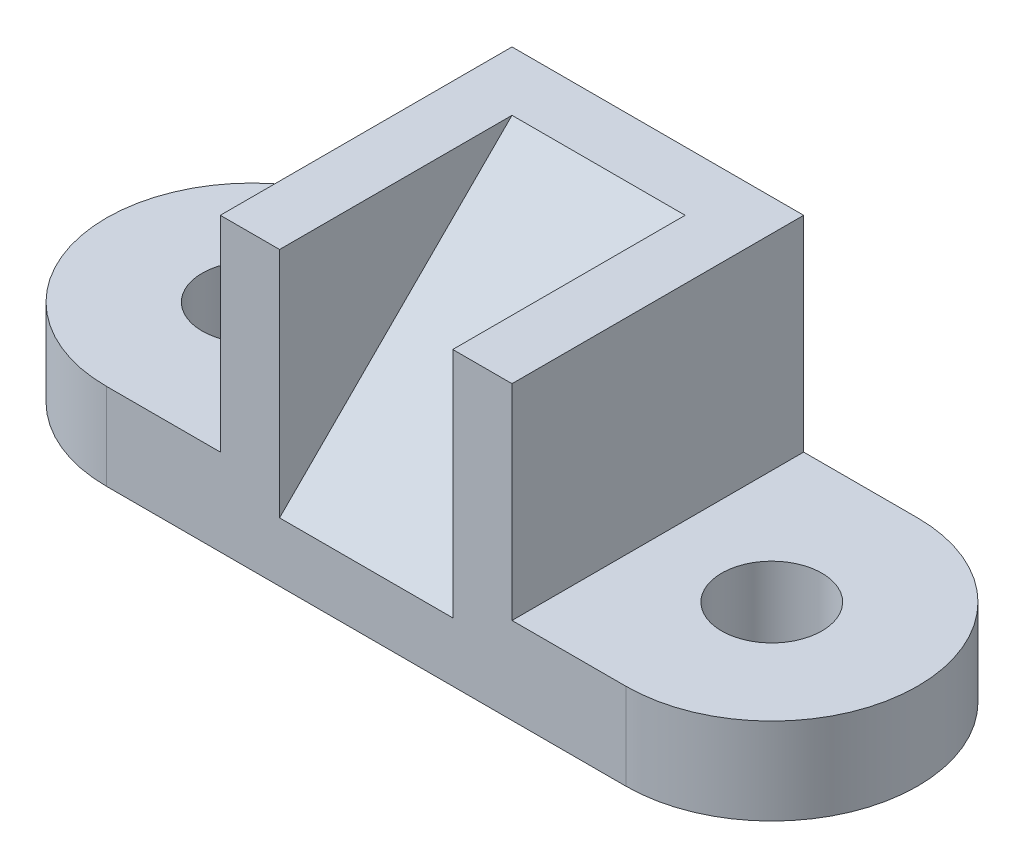
ISO-10303-21;
HEADER;
FILE_DESCRIPTION(('STEP AP214'),'2;1');
FILE_NAME('part.step','',(''),(''),'','','');
FILE_SCHEMA(('AUTOMOTIVE_DESIGN { 1 0 10303 214 1 1 1 1 }'));
ENDSEC;
DATA;
#1=APPLICATION_CONTEXT('core data for automotive mechanical design processes');
#2=APPLICATION_PROTOCOL_DEFINITION('international standard','automotive_design',2000,#1);
#3=PRODUCT_CONTEXT('',#1,'mechanical');
#4=PRODUCT('Part','Part','',(#3));
#5=PRODUCT_RELATED_PRODUCT_CATEGORY('part','',(#4));
#6=PRODUCT_DEFINITION_FORMATION('','',#4);
#7=PRODUCT_DEFINITION_CONTEXT('part definition',#1,'design');
#8=PRODUCT_DEFINITION('design','',#6,#7);
#9=PRODUCT_DEFINITION_SHAPE('','',#8);
#10=(LENGTH_UNIT() NAMED_UNIT(*) SI_UNIT(.MILLI.,.METRE.));
#11=(NAMED_UNIT(*) PLANE_ANGLE_UNIT() SI_UNIT($,.RADIAN.));
#12=(NAMED_UNIT(*) SI_UNIT($,.STERADIAN.) SOLID_ANGLE_UNIT());
#13=UNCERTAINTY_MEASURE_WITH_UNIT(LENGTH_MEASURE(1.E-05),#10,'distance_accuracy_value','');
#14=(GEOMETRIC_REPRESENTATION_CONTEXT(3) GLOBAL_UNCERTAINTY_ASSIGNED_CONTEXT((#13)) GLOBAL_UNIT_ASSIGNED_CONTEXT((#10,
#11,#12)) REPRESENTATION_CONTEXT('',''));
#15=CARTESIAN_POINT('',(0.,0.,0.));
#16=DIRECTION('',(0.,0.,1.));
#17=DIRECTION('',(1.,0.,0.));
#18=AXIS2_PLACEMENT_3D('',#15,#16,#17);
#19=CARTESIAN_POINT('',(-57.,19.,32.));
#20=DIRECTION('',(0.,0.,-1.));
#21=DIRECTION('',(-1.,0.,0.));
#22=AXIS2_PLACEMENT_3D('',#19,#20,#21);
#23=PLANE('',#22);
#24=DIRECTION('',(0.,1.,0.));
#25=VECTOR('',#24,1.);
#26=CARTESIAN_POINT('',(19.,13.,32.));
#27=LINE('',#26,#25);
#28=CARTESIAN_POINT('',(19.,13.,32.));
#29=VERTEX_POINT('',#28);
#30=CARTESIAN_POINT('',(19.,64.,32.));
#31=VERTEX_POINT('',#30);
#32=EDGE_CURVE('E129',#29,#31,#27,.T.);
#33=ORIENTED_EDGE('',*,*,#32,.F.);
#34=DIRECTION('',(-1.,0.,0.));
#35=VECTOR('',#34,1.);
#36=CARTESIAN_POINT('',(19.,13.,32.));
#37=LINE('',#36,#35);
#38=CARTESIAN_POINT('',(-19.,13.,32.));
#39=VERTEX_POINT('',#38);
#40=EDGE_CURVE('E169',#29,#39,#37,.T.);
#41=ORIENTED_EDGE('',*,*,#40,.T.);
#42=DIRECTION('',(0.,1.,0.));
#43=VECTOR('',#42,1.);
#44=CARTESIAN_POINT('',(-19.,13.,32.));
#45=LINE('',#44,#43);
#46=CARTESIAN_POINT('',(-19.,64.,32.));
#47=VERTEX_POINT('',#46);
#48=EDGE_CURVE('E282',#39,#47,#45,.T.);
#49=ORIENTED_EDGE('',*,*,#48,.T.);
#50=DIRECTION('',(1.,0.,0.));
#51=VECTOR('',#50,1.);
#52=CARTESIAN_POINT('',(-32.,64.,32.));
#53=LINE('',#52,#51);
#54=CARTESIAN_POINT('',(-32.,64.,32.));
#55=VERTEX_POINT('',#54);
#56=EDGE_CURVE('E155',#55,#47,#53,.T.);
#57=ORIENTED_EDGE('',*,*,#56,.F.);
#58=DIRECTION('',(0.,-1.,0.));
#59=VECTOR('',#58,1.);
#60=CARTESIAN_POINT('',(-32.,64.,32.));
#61=LINE('',#60,#59);
#62=CARTESIAN_POINT('',(-32.,19.,32.));
#63=VERTEX_POINT('',#62);
#64=EDGE_CURVE('E175',#55,#63,#61,.T.);
#65=ORIENTED_EDGE('',*,*,#64,.T.);
#66=DIRECTION('',(1.,0.,0.));
#67=VECTOR('',#66,1.);
#68=CARTESIAN_POINT('',(-57.,19.,32.));
#69=LINE('',#68,#67);
#70=CARTESIAN_POINT('',(-57.,19.,32.));
#71=VERTEX_POINT('',#70);
#72=EDGE_CURVE('E210',#71,#63,#69,.T.);
#73=ORIENTED_EDGE('',*,*,#72,.F.);
#74=DIRECTION('',(0.,-1.,0.));
#75=VECTOR('',#74,1.);
#76=CARTESIAN_POINT('',(-57.,19.,32.));
#77=LINE('',#76,#75);
#78=CARTESIAN_POINT('',(-57.,0.,32.));
#79=VERTEX_POINT('',#78);
#80=EDGE_CURVE('E11',#71,#79,#77,.T.);
#81=ORIENTED_EDGE('',*,*,#80,.T.);
#82=DIRECTION('',(1.,0.,0.));
#83=VECTOR('',#82,1.);
#84=CARTESIAN_POINT('',(-57.,0.,32.));
#85=LINE('',#84,#83);
#86=CARTESIAN_POINT('',(57.,0.,32.));
#87=VERTEX_POINT('',#86);
#88=EDGE_CURVE('E224',#79,#87,#85,.T.);
#89=ORIENTED_EDGE('',*,*,#88,.T.);
#90=DIRECTION('',(0.,-1.,0.));
#91=VECTOR('',#90,1.);
#92=CARTESIAN_POINT('',(57.,19.,32.));
#93=LINE('',#92,#91);
#94=CARTESIAN_POINT('',(57.,19.,32.));
#95=VERTEX_POINT('',#94);
#96=EDGE_CURVE('E54',#95,#87,#93,.T.);
#97=ORIENTED_EDGE('',*,*,#96,.F.);
#98=CARTESIAN_POINT('',(32.,19.,32.));
#99=VERTEX_POINT('',#98);
#100=EDGE_CURVE('E208',#99,#95,#69,.T.);
#101=ORIENTED_EDGE('',*,*,#100,.F.);
#102=DIRECTION('',(0.,-1.,0.));
#103=VECTOR('',#102,1.);
#104=CARTESIAN_POINT('',(32.,64.,32.));
#105=LINE('',#104,#103);
#106=CARTESIAN_POINT('',(32.,64.,32.));
#107=VERTEX_POINT('',#106);
#108=EDGE_CURVE('E152',#107,#99,#105,.T.);
#109=ORIENTED_EDGE('',*,*,#108,.F.);
#110=EDGE_CURVE('E144',#31,#107,#53,.T.);
#111=ORIENTED_EDGE('',*,*,#110,.F.);
#112=EDGE_LOOP('',(#33,#41,#49,#57,#65,#73,#81,#89,#97,#101,#109,#111));
#113=FACE_BOUND('',#112,.T.);
#114=ADVANCED_FACE('F45',(#113),#23,.F.);
#115=CARTESIAN_POINT('',(0.,64.,0.));
#116=DIRECTION('',(0.,-1.,0.));
#117=DIRECTION('',(0.,0.,-1.));
#118=AXIS2_PLACEMENT_3D('',#115,#116,#117);
#119=PLANE('',#118);
#120=DIRECTION('',(0.,0.,-1.));
#121=VECTOR('',#120,1.);
#122=CARTESIAN_POINT('',(19.,64.,32.));
#123=LINE('',#122,#121);
#124=CARTESIAN_POINT('',(19.,64.,-19.));
#125=VERTEX_POINT('',#124);
#126=EDGE_CURVE('E132',#31,#125,#123,.T.);
#127=ORIENTED_EDGE('',*,*,#126,.F.);
#128=ORIENTED_EDGE('',*,*,#110,.T.);
#129=DIRECTION('',(0.,0.,-1.));
#130=VECTOR('',#129,1.);
#131=CARTESIAN_POINT('',(32.,64.,32.));
#132=LINE('',#131,#130);
#133=CARTESIAN_POINT('',(32.,64.,-32.));
#134=VERTEX_POINT('',#133);
#135=EDGE_CURVE('E172',#107,#134,#132,.T.);
#136=ORIENTED_EDGE('',*,*,#135,.T.);
#137=DIRECTION('',(-1.,0.,0.));
#138=VECTOR('',#137,1.);
#139=CARTESIAN_POINT('',(-32.,64.,-32.));
#140=LINE('',#139,#138);
#141=CARTESIAN_POINT('',(-32.,64.,-32.));
#142=VERTEX_POINT('',#141);
#143=EDGE_CURVE('E161',#134,#142,#140,.T.);
#144=ORIENTED_EDGE('',*,*,#143,.T.);
#145=DIRECTION('',(0.,0.,1.));
#146=VECTOR('',#145,1.);
#147=CARTESIAN_POINT('',(-32.,64.,32.));
#148=LINE('',#147,#146);
#149=EDGE_CURVE('E156',#142,#55,#148,.T.);
#150=ORIENTED_EDGE('',*,*,#149,.T.);
#151=ORIENTED_EDGE('',*,*,#56,.T.);
#152=DIRECTION('',(0.,0.,-1.));
#153=VECTOR('',#152,1.);
#154=CARTESIAN_POINT('',(-19.,64.,32.));
#155=LINE('',#154,#153);
#156=CARTESIAN_POINT('',(-19.,64.,-19.));
#157=VERTEX_POINT('',#156);
#158=EDGE_CURVE('E279',#47,#157,#155,.T.);
#159=ORIENTED_EDGE('',*,*,#158,.T.);
#160=DIRECTION('',(-1.,0.,0.));
#161=VECTOR('',#160,1.);
#162=CARTESIAN_POINT('',(19.,64.,-19.));
#163=LINE('',#162,#161);
#164=EDGE_CURVE('E147',#125,#157,#163,.T.);
#165=ORIENTED_EDGE('',*,*,#164,.F.);
#166=EDGE_LOOP('',(#127,#128,#136,#144,#150,#151,#159,#165));
#167=FACE_BOUND('',#166,.T.);
#168=ADVANCED_FACE('F142',(#167),#119,.F.);
#169=CARTESIAN_POINT('',(-57.,19.,0.));
#170=DIRECTION('',(0.,1.,0.));
#171=DIRECTION('',(0.,0.,1.));
#172=AXIS2_PLACEMENT_3D('',#169,#170,#171);
#173=PLANE('',#172);
#174=DIRECTION('',(0.,0.,-1.));
#175=VECTOR('',#174,1.);
#176=CARTESIAN_POINT('',(32.,19.,32.));
#177=LINE('',#176,#175);
#178=CARTESIAN_POINT('',(32.,19.,-32.));
#179=VERTEX_POINT('',#178);
#180=EDGE_CURVE('E165',#99,#179,#177,.T.);
#181=ORIENTED_EDGE('',*,*,#180,.F.);
#182=ORIENTED_EDGE('',*,*,#100,.T.);
#183=CARTESIAN_POINT('',(57.,19.,0.));
#184=DIRECTION('',(0.,1.,0.));
#185=DIRECTION('',(0.,0.,1.));
#186=AXIS2_PLACEMENT_3D('',#183,#184,#185);
#187=CIRCLE('',#186,32.);
#188=CARTESIAN_POINT('',(57.,19.,-32.));
#189=VERTEX_POINT('',#188);
#190=EDGE_CURVE('E213',#95,#189,#187,.T.);
#191=ORIENTED_EDGE('',*,*,#190,.T.);
#192=DIRECTION('',(-1.,0.,0.));
#193=VECTOR('',#192,1.);
#194=CARTESIAN_POINT('',(-57.,19.,-32.));
#195=LINE('',#194,#193);
#196=EDGE_CURVE('E217',#189,#179,#195,.T.);
#197=ORIENTED_EDGE('',*,*,#196,.T.);
#198=EDGE_LOOP('',(#181,#182,#191,#197));
#199=FACE_BOUND('',#198,.T.);
#200=CARTESIAN_POINT('',(57.,19.,0.));
#201=DIRECTION('',(0.,1.,0.));
#202=DIRECTION('',(0.,0.,1.));
#203=AXIS2_PLACEMENT_3D('',#200,#201,#202);
#204=CIRCLE('',#203,11.);
#205=CARTESIAN_POINT('',(57.,19.,11.));
#206=VERTEX_POINT('',#205);
#207=EDGE_CURVE('E188',#206,#206,#204,.T.);
#208=ORIENTED_EDGE('',*,*,#207,.F.);
#209=EDGE_LOOP('',(#208));
#210=FACE_BOUND('',#209,.T.);
#211=ADVANCED_FACE('F264',(#199,#210),#173,.T.);
#212=DIRECTION('',(0.,0.,1.));
#213=VECTOR('',#212,1.);
#214=CARTESIAN_POINT('',(-32.,19.,32.));
#215=LINE('',#214,#213);
#216=CARTESIAN_POINT('',(-32.,19.,-32.));
#217=VERTEX_POINT('',#216);
#218=EDGE_CURVE('E69',#217,#63,#215,.T.);
#219=ORIENTED_EDGE('',*,*,#218,.F.);
#220=CARTESIAN_POINT('',(-57.,19.,-32.));
#221=VERTEX_POINT('',#220);
#222=EDGE_CURVE('E216',#217,#221,#195,.T.);
#223=ORIENTED_EDGE('',*,*,#222,.T.);
#224=CARTESIAN_POINT('',(-57.,19.,0.));
#225=DIRECTION('',(0.,1.,0.));
#226=DIRECTION('',(0.,0.,1.));
#227=AXIS2_PLACEMENT_3D('',#224,#225,#226);
#228=CIRCLE('',#227,32.);
#229=EDGE_CURVE('E204',#221,#71,#228,.T.);
#230=ORIENTED_EDGE('',*,*,#229,.T.);
#231=ORIENTED_EDGE('',*,*,#72,.T.);
#232=EDGE_LOOP('',(#219,#223,#230,#231));
#233=FACE_BOUND('',#232,.T.);
#234=CARTESIAN_POINT('',(-57.,19.,0.));
#235=DIRECTION('',(0.,1.,0.));
#236=DIRECTION('',(0.,0.,1.));
#237=AXIS2_PLACEMENT_3D('',#234,#235,#236);
#238=CIRCLE('',#237,11.);
#239=CARTESIAN_POINT('',(-57.,19.,11.));
#240=VERTEX_POINT('',#239);
#241=EDGE_CURVE('E196',#240,#240,#238,.T.);
#242=ORIENTED_EDGE('',*,*,#241,.F.);
#243=EDGE_LOOP('',(#242));
#244=FACE_BOUND('',#243,.T.);
#245=ADVANCED_FACE('F258',(#233,#244),#173,.T.);
#246=CARTESIAN_POINT('',(-57.,0.,0.));
#247=DIRECTION('',(0.,1.,0.));
#248=DIRECTION('',(0.,0.,1.));
#249=AXIS2_PLACEMENT_3D('',#246,#247,#248);
#250=PLANE('',#249);
#251=CARTESIAN_POINT('',(-57.,0.,0.));
#252=DIRECTION('',(0.,1.,0.));
#253=DIRECTION('',(0.,0.,1.));
#254=AXIS2_PLACEMENT_3D('',#251,#252,#253);
#255=CIRCLE('',#254,32.);
#256=CARTESIAN_POINT('',(-57.,0.,-32.));
#257=VERTEX_POINT('',#256);
#258=EDGE_CURVE('E200',#257,#79,#255,.T.);
#259=ORIENTED_EDGE('',*,*,#258,.F.);
#260=DIRECTION('',(-1.,0.,0.));
#261=VECTOR('',#260,1.);
#262=CARTESIAN_POINT('',(-57.,0.,-32.));
#263=LINE('',#262,#261);
#264=CARTESIAN_POINT('',(57.,0.,-32.));
#265=VERTEX_POINT('',#264);
#266=EDGE_CURVE('E209',#265,#257,#263,.T.);
#267=ORIENTED_EDGE('',*,*,#266,.F.);
#268=CARTESIAN_POINT('',(57.,0.,0.));
#269=DIRECTION('',(0.,1.,0.));
#270=DIRECTION('',(0.,0.,1.));
#271=AXIS2_PLACEMENT_3D('',#268,#269,#270);
#272=CIRCLE('',#271,32.);
#273=EDGE_CURVE('E227',#87,#265,#272,.T.);
#274=ORIENTED_EDGE('',*,*,#273,.F.);
#275=ORIENTED_EDGE('',*,*,#88,.F.);
#276=EDGE_LOOP('',(#259,#267,#274,#275));
#277=FACE_BOUND('',#276,.T.);
#278=CARTESIAN_POINT('',(-57.,0.,0.));
#279=DIRECTION('',(0.,1.,0.));
#280=DIRECTION('',(0.,0.,1.));
#281=AXIS2_PLACEMENT_3D('',#278,#279,#280);
#282=CIRCLE('',#281,11.);
#283=CARTESIAN_POINT('',(-57.,0.,11.));
#284=VERTEX_POINT('',#283);
#285=EDGE_CURVE('E192',#284,#284,#282,.T.);
#286=ORIENTED_EDGE('',*,*,#285,.T.);
#287=EDGE_LOOP('',(#286));
#288=FACE_BOUND('',#287,.T.);
#289=CARTESIAN_POINT('',(57.,0.,0.));
#290=DIRECTION('',(0.,1.,0.));
#291=DIRECTION('',(0.,0.,1.));
#292=AXIS2_PLACEMENT_3D('',#289,#290,#291);
#293=CIRCLE('',#292,11.);
#294=CARTESIAN_POINT('',(57.,0.,11.));
#295=VERTEX_POINT('',#294);
#296=EDGE_CURVE('E187',#295,#295,#293,.T.);
#297=ORIENTED_EDGE('',*,*,#296,.T.);
#298=EDGE_LOOP('',(#297));
#299=FACE_BOUND('',#298,.T.);
#300=ADVANCED_FACE('F249',(#277,#288,#299),#250,.F.);
#301=CARTESIAN_POINT('',(-57.,19.,0.));
#302=DIRECTION('',(0.,-1.,0.));
#303=DIRECTION('',(0.,0.,-1.));
#304=AXIS2_PLACEMENT_3D('',#301,#302,#303);
#305=CYLINDRICAL_SURFACE('',#304,32.);
#306=ORIENTED_EDGE('',*,*,#258,.T.);
#307=ORIENTED_EDGE('',*,*,#80,.F.);
#308=ORIENTED_EDGE('',*,*,#229,.F.);
#309=DIRECTION('',(0.,-1.,0.));
#310=VECTOR('',#309,1.);
#311=CARTESIAN_POINT('',(-57.,19.,-32.));
#312=LINE('',#311,#310);
#313=EDGE_CURVE('E220',#221,#257,#312,.T.);
#314=ORIENTED_EDGE('',*,*,#313,.T.);
#315=EDGE_LOOP('',(#306,#307,#308,#314));
#316=FACE_BOUND('',#315,.T.);
#317=ADVANCED_FACE('F47',(#316),#305,.T.);
#318=CARTESIAN_POINT('',(57.,19.,0.));
#319=DIRECTION('',(0.,-1.,0.));
#320=DIRECTION('',(0.,0.,-1.));
#321=AXIS2_PLACEMENT_3D('',#318,#319,#320);
#322=CYLINDRICAL_SURFACE('',#321,32.);
#323=ORIENTED_EDGE('',*,*,#273,.T.);
#324=DIRECTION('',(0.,-1.,0.));
#325=VECTOR('',#324,1.);
#326=CARTESIAN_POINT('',(57.,19.,-32.));
#327=LINE('',#326,#325);
#328=EDGE_CURVE('E235',#189,#265,#327,.T.);
#329=ORIENTED_EDGE('',*,*,#328,.F.);
#330=ORIENTED_EDGE('',*,*,#190,.F.);
#331=ORIENTED_EDGE('',*,*,#96,.T.);
#332=EDGE_LOOP('',(#323,#329,#330,#331));
#333=FACE_BOUND('',#332,.T.);
#334=ADVANCED_FACE('F244',(#333),#322,.T.);
#335=CARTESIAN_POINT('',(-57.,19.,-32.));
#336=DIRECTION('',(0.,0.,1.));
#337=DIRECTION('',(1.,0.,0.));
#338=AXIS2_PLACEMENT_3D('',#335,#336,#337);
#339=PLANE('',#338);
#340=ORIENTED_EDGE('',*,*,#266,.T.);
#341=ORIENTED_EDGE('',*,*,#313,.F.);
#342=ORIENTED_EDGE('',*,*,#222,.F.);
#343=DIRECTION('',(0.,-1.,0.));
#344=VECTOR('',#343,1.);
#345=CARTESIAN_POINT('',(-32.,64.,-32.));
#346=LINE('',#345,#344);
#347=EDGE_CURVE('E179',#142,#217,#346,.T.);
#348=ORIENTED_EDGE('',*,*,#347,.F.);
#349=ORIENTED_EDGE('',*,*,#143,.F.);
#350=DIRECTION('',(0.,-1.,0.));
#351=VECTOR('',#350,1.);
#352=CARTESIAN_POINT('',(32.,64.,-32.));
#353=LINE('',#352,#351);
#354=EDGE_CURVE('E183',#134,#179,#353,.T.);
#355=ORIENTED_EDGE('',*,*,#354,.T.);
#356=ORIENTED_EDGE('',*,*,#196,.F.);
#357=ORIENTED_EDGE('',*,*,#328,.T.);
#358=EDGE_LOOP('',(#340,#341,#342,#348,#349,#355,#356,#357));
#359=FACE_BOUND('',#358,.T.);
#360=ADVANCED_FACE('F253',(#359),#339,.F.);
#361=CARTESIAN_POINT('',(-57.,19.,0.));
#362=DIRECTION('',(0.,-1.,0.));
#363=DIRECTION('',(0.,0.,-1.));
#364=AXIS2_PLACEMENT_3D('',#361,#362,#363);
#365=CYLINDRICAL_SURFACE('',#364,11.);
#366=ORIENTED_EDGE('',*,*,#241,.T.);
#367=EDGE_LOOP('',(#366));
#368=FACE_BOUND('',#367,.T.);
#369=ORIENTED_EDGE('',*,*,#285,.F.);
#370=EDGE_LOOP('',(#369));
#371=FACE_BOUND('',#370,.T.);
#372=ADVANCED_FACE('F313',(#368,#371),#365,.F.);
#373=CARTESIAN_POINT('',(57.,19.,0.));
#374=DIRECTION('',(0.,-1.,0.));
#375=DIRECTION('',(0.,0.,-1.));
#376=AXIS2_PLACEMENT_3D('',#373,#374,#375);
#377=CYLINDRICAL_SURFACE('',#376,11.);
#378=ORIENTED_EDGE('',*,*,#207,.T.);
#379=EDGE_LOOP('',(#378));
#380=FACE_BOUND('',#379,.T.);
#381=ORIENTED_EDGE('',*,*,#296,.F.);
#382=EDGE_LOOP('',(#381));
#383=FACE_BOUND('',#382,.T.);
#384=ADVANCED_FACE('F302',(#380,#383),#377,.F.);
#385=CARTESIAN_POINT('',(32.,64.,32.));
#386=DIRECTION('',(-1.,0.,0.));
#387=DIRECTION('',(0.,0.,1.));
#388=AXIS2_PLACEMENT_3D('',#385,#386,#387);
#389=PLANE('',#388);
#390=ORIENTED_EDGE('',*,*,#180,.T.);
#391=ORIENTED_EDGE('',*,*,#354,.F.);
#392=ORIENTED_EDGE('',*,*,#135,.F.);
#393=ORIENTED_EDGE('',*,*,#108,.T.);
#394=EDGE_LOOP('',(#390,#391,#392,#393));
#395=FACE_BOUND('',#394,.T.);
#396=ADVANCED_FACE('F267',(#395),#389,.F.);
#397=CARTESIAN_POINT('',(-32.,64.,32.));
#398=DIRECTION('',(1.,0.,0.));
#399=DIRECTION('',(0.,0.,-1.));
#400=AXIS2_PLACEMENT_3D('',#397,#398,#399);
#401=PLANE('',#400);
#402=ORIENTED_EDGE('',*,*,#218,.T.);
#403=ORIENTED_EDGE('',*,*,#64,.F.);
#404=ORIENTED_EDGE('',*,*,#149,.F.);
#405=ORIENTED_EDGE('',*,*,#347,.T.);
#406=EDGE_LOOP('',(#402,#403,#404,#405));
#407=FACE_BOUND('',#406,.T.);
#408=ADVANCED_FACE('F291',(#407),#401,.F.);
#409=CARTESIAN_POINT('',(19.,64.,-19.));
#410=DIRECTION('',(0.,-0.707106781186548,-0.707106781186547));
#411=DIRECTION('',(0.,0.707106781186547,-0.707106781186548));
#412=AXIS2_PLACEMENT_3D('',#409,#410,#411);
#413=PLANE('',#412);
#414=DIRECTION('',(0.,-0.707106781186547,0.707106781186548));
#415=VECTOR('',#414,1.);
#416=CARTESIAN_POINT('',(-19.,64.,-19.));
#417=LINE('',#416,#415);
#418=EDGE_CURVE('E61',#157,#39,#417,.T.);
#419=ORIENTED_EDGE('',*,*,#418,.T.);
#420=ORIENTED_EDGE('',*,*,#40,.F.);
#421=DIRECTION('',(0.,-0.707106781186547,0.707106781186548));
#422=VECTOR('',#421,1.);
#423=CARTESIAN_POINT('',(19.,64.,-19.));
#424=LINE('',#423,#422);
#425=EDGE_CURVE('E134',#125,#29,#424,.T.);
#426=ORIENTED_EDGE('',*,*,#425,.F.);
#427=ORIENTED_EDGE('',*,*,#164,.T.);
#428=EDGE_LOOP('',(#419,#420,#426,#427));
#429=FACE_BOUND('',#428,.T.);
#430=ADVANCED_FACE('F293',(#429),#413,.F.);
#431=CARTESIAN_POINT('',(19.,0.,0.));
#432=DIRECTION('',(-1.,0.,0.));
#433=DIRECTION('',(0.,0.,1.));
#434=AXIS2_PLACEMENT_3D('',#431,#432,#433);
#435=PLANE('',#434);
#436=ORIENTED_EDGE('',*,*,#32,.T.);
#437=ORIENTED_EDGE('',*,*,#126,.T.);
#438=ORIENTED_EDGE('',*,*,#425,.T.);
#439=EDGE_LOOP('',(#436,#437,#438));
#440=FACE_BOUND('',#439,.T.);
#441=ADVANCED_FACE('F131',(#440),#435,.T.);
#442=CARTESIAN_POINT('',(-19.,0.,0.));
#443=DIRECTION('',(-1.,0.,0.));
#444=DIRECTION('',(0.,0.,1.));
#445=AXIS2_PLACEMENT_3D('',#442,#443,#444);
#446=PLANE('',#445);
#447=ORIENTED_EDGE('',*,*,#48,.F.);
#448=ORIENTED_EDGE('',*,*,#418,.F.);
#449=ORIENTED_EDGE('',*,*,#158,.F.);
#450=EDGE_LOOP('',(#447,#448,#449));
#451=FACE_BOUND('',#450,.T.);
#452=ADVANCED_FACE('F380',(#451),#446,.F.);
#453=CLOSED_SHELL('',(#114,#168,#211,#245,#300,#317,#334,#360,#372,#384,#396,#408,#430,#441,#452));
#454=MANIFOLD_SOLID_BREP('B2',#453);
#455=ADVANCED_BREP_SHAPE_REPRESENTATION('',(#18,#454),#14);
#456=SHAPE_DEFINITION_REPRESENTATION(#9,#455);
ENDSEC;
END-ISO-10303-21;
